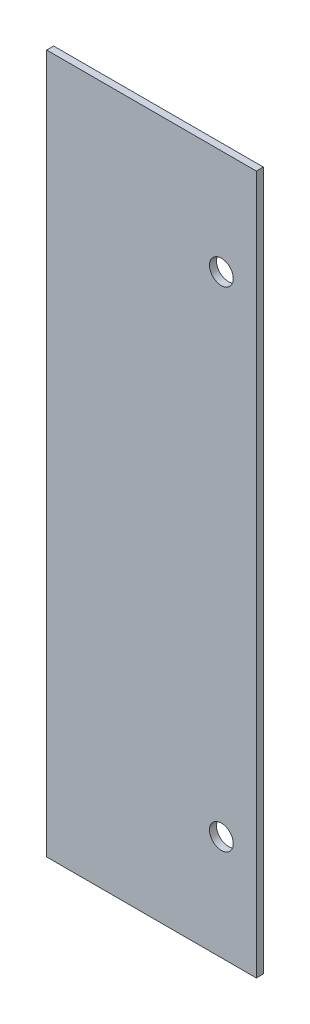
ISO-10303-21;
HEADER;
FILE_DESCRIPTION(('STEP AP214'),'2;1');
FILE_NAME('part.step','',(''),(''),'','','');
FILE_SCHEMA(('AUTOMOTIVE_DESIGN { 1 0 10303 214 1 1 1 1 }'));
ENDSEC;
DATA;
#1=APPLICATION_CONTEXT('core data for automotive mechanical design processes');
#2=APPLICATION_PROTOCOL_DEFINITION('international standard','automotive_design',2000,#1);
#3=PRODUCT_CONTEXT('',#1,'mechanical');
#4=PRODUCT('Part','Part','',(#3));
#5=PRODUCT_RELATED_PRODUCT_CATEGORY('part','',(#4));
#6=PRODUCT_DEFINITION_FORMATION('','',#4);
#7=PRODUCT_DEFINITION_CONTEXT('part definition',#1,'design');
#8=PRODUCT_DEFINITION('design','',#6,#7);
#9=PRODUCT_DEFINITION_SHAPE('','',#8);
#10=(LENGTH_UNIT() NAMED_UNIT(*) SI_UNIT(.MILLI.,.METRE.));
#11=(NAMED_UNIT(*) PLANE_ANGLE_UNIT() SI_UNIT($,.RADIAN.));
#12=(NAMED_UNIT(*) SI_UNIT($,.STERADIAN.) SOLID_ANGLE_UNIT());
#13=UNCERTAINTY_MEASURE_WITH_UNIT(LENGTH_MEASURE(1.E-05),#10,'distance_accuracy_value','');
#14=(GEOMETRIC_REPRESENTATION_CONTEXT(3) GLOBAL_UNCERTAINTY_ASSIGNED_CONTEXT((#13)) GLOBAL_UNIT_ASSIGNED_CONTEXT((#10,
#11,#12)) REPRESENTATION_CONTEXT('',''));
#15=CARTESIAN_POINT('',(0.,0.,0.));
#16=DIRECTION('',(0.,0.,1.));
#17=DIRECTION('',(1.,0.,0.));
#18=AXIS2_PLACEMENT_3D('',#15,#16,#17);
#19=CARTESIAN_POINT('',(0.,0.,0.));
#20=DIRECTION('',(0.,0.,-1.));
#21=DIRECTION('',(-1.,0.,0.));
#22=AXIS2_PLACEMENT_3D('',#19,#20,#21);
#23=PLANE('',#22);
#24=DIRECTION('',(0.,1.,0.));
#25=VECTOR('',#24,1.);
#26=CARTESIAN_POINT('',(15.,-50.,0.));
#27=LINE('',#26,#25);
#28=CARTESIAN_POINT('',(15.,-50.,0.));
#29=VERTEX_POINT('',#28);
#30=CARTESIAN_POINT('',(15.,50.,0.));
#31=VERTEX_POINT('',#30);
#32=EDGE_CURVE('E112',#29,#31,#27,.T.);
#33=ORIENTED_EDGE('',*,*,#32,.T.);
#34=DIRECTION('',(-1.,0.,0.));
#35=VECTOR('',#34,1.);
#36=CARTESIAN_POINT('',(-15.,50.,0.));
#37=LINE('',#36,#35);
#38=CARTESIAN_POINT('',(-15.,50.,0.));
#39=VERTEX_POINT('',#38);
#40=EDGE_CURVE('E111',#31,#39,#37,.T.);
#41=ORIENTED_EDGE('',*,*,#40,.T.);
#42=DIRECTION('',(0.,-1.,0.));
#43=VECTOR('',#42,1.);
#44=CARTESIAN_POINT('',(-15.,-50.,0.));
#45=LINE('',#44,#43);
#46=CARTESIAN_POINT('',(-15.,-50.,0.));
#47=VERTEX_POINT('',#46);
#48=EDGE_CURVE('E92',#39,#47,#45,.T.);
#49=ORIENTED_EDGE('',*,*,#48,.T.);
#50=DIRECTION('',(1.,0.,0.));
#51=VECTOR('',#50,1.);
#52=CARTESIAN_POINT('',(-15.,-50.,0.));
#53=LINE('',#52,#51);
#54=EDGE_CURVE('E106',#47,#29,#53,.T.);
#55=ORIENTED_EDGE('',*,*,#54,.T.);
#56=EDGE_LOOP('',(#33,#41,#49,#55));
#57=FACE_BOUND('',#56,.T.);
#58=CARTESIAN_POINT('',(10.,35.,1.2E-05));
#59=DIRECTION('',(0.,0.,1.));
#60=DIRECTION('',(1.,0.,0.));
#61=AXIS2_PLACEMENT_3D('',#58,#59,#60);
#62=CIRCLE('',#61,1.7);
#63=CARTESIAN_POINT('',(11.7,35.,1.2E-05));
#64=VERTEX_POINT('',#63);
#65=EDGE_CURVE('E127',#64,#64,#62,.T.);
#66=ORIENTED_EDGE('',*,*,#65,.F.);
#67=EDGE_LOOP('',(#66));
#68=FACE_BOUND('',#67,.T.);
#69=CARTESIAN_POINT('',(10.,-35.,1.2E-05));
#70=DIRECTION('',(0.,0.,1.));
#71=DIRECTION('',(1.,0.,0.));
#72=AXIS2_PLACEMENT_3D('',#69,#70,#71);
#73=CIRCLE('',#72,1.7);
#74=CARTESIAN_POINT('',(11.7,-35.,1.2E-05));
#75=VERTEX_POINT('',#74);
#76=EDGE_CURVE('E113',#75,#75,#73,.T.);
#77=ORIENTED_EDGE('',*,*,#76,.F.);
#78=EDGE_LOOP('',(#77));
#79=FACE_BOUND('',#78,.T.);
#80=ADVANCED_FACE('F41',(#57,#68,#79),#23,.F.);
#81=CARTESIAN_POINT('',(15.,-50.,-1.));
#82=DIRECTION('',(1.,0.,0.));
#83=DIRECTION('',(0.,0.,-1.));
#84=AXIS2_PLACEMENT_3D('',#81,#82,#83);
#85=PLANE('',#84);
#86=ORIENTED_EDGE('',*,*,#32,.F.);
#87=DIRECTION('',(0.,0.,1.));
#88=VECTOR('',#87,1.);
#89=CARTESIAN_POINT('',(15.,-50.,-1.));
#90=LINE('',#89,#88);
#91=CARTESIAN_POINT('',(15.,-50.,-1.));
#92=VERTEX_POINT('',#91);
#93=EDGE_CURVE('E11',#92,#29,#90,.T.);
#94=ORIENTED_EDGE('',*,*,#93,.F.);
#95=DIRECTION('',(0.,1.,0.));
#96=VECTOR('',#95,1.);
#97=CARTESIAN_POINT('',(15.,-50.,-1.));
#98=LINE('',#97,#96);
#99=CARTESIAN_POINT('',(15.,50.,-1.));
#100=VERTEX_POINT('',#99);
#101=EDGE_CURVE('E102',#92,#100,#98,.T.);
#102=ORIENTED_EDGE('',*,*,#101,.T.);
#103=DIRECTION('',(0.,0.,1.));
#104=VECTOR('',#103,1.);
#105=CARTESIAN_POINT('',(15.,50.,-1.));
#106=LINE('',#105,#104);
#107=EDGE_CURVE('E87',#100,#31,#106,.T.);
#108=ORIENTED_EDGE('',*,*,#107,.T.);
#109=EDGE_LOOP('',(#86,#94,#102,#108));
#110=FACE_BOUND('',#109,.T.);
#111=ADVANCED_FACE('F43',(#110),#85,.T.);
#112=CARTESIAN_POINT('',(-15.,-50.,-1.));
#113=DIRECTION('',(0.,-1.,0.));
#114=DIRECTION('',(0.,0.,-1.));
#115=AXIS2_PLACEMENT_3D('',#112,#113,#114);
#116=PLANE('',#115);
#117=ORIENTED_EDGE('',*,*,#54,.F.);
#118=DIRECTION('',(0.,0.,1.));
#119=VECTOR('',#118,1.);
#120=CARTESIAN_POINT('',(-15.,-50.,-1.));
#121=LINE('',#120,#119);
#122=CARTESIAN_POINT('',(-15.,-50.,-1.));
#123=VERTEX_POINT('',#122);
#124=EDGE_CURVE('E52',#123,#47,#121,.T.);
#125=ORIENTED_EDGE('',*,*,#124,.F.);
#126=DIRECTION('',(1.,0.,0.));
#127=VECTOR('',#126,1.);
#128=CARTESIAN_POINT('',(-15.,-50.,-1.));
#129=LINE('',#128,#127);
#130=EDGE_CURVE('E101',#123,#92,#129,.T.);
#131=ORIENTED_EDGE('',*,*,#130,.T.);
#132=ORIENTED_EDGE('',*,*,#93,.T.);
#133=EDGE_LOOP('',(#117,#125,#131,#132));
#134=FACE_BOUND('',#133,.T.);
#135=ADVANCED_FACE('F143',(#134),#116,.T.);
#136=CARTESIAN_POINT('',(-15.,-50.,-1.));
#137=DIRECTION('',(-1.,0.,0.));
#138=DIRECTION('',(0.,0.,1.));
#139=AXIS2_PLACEMENT_3D('',#136,#137,#138);
#140=PLANE('',#139);
#141=ORIENTED_EDGE('',*,*,#48,.F.);
#142=DIRECTION('',(0.,0.,1.));
#143=VECTOR('',#142,1.);
#144=CARTESIAN_POINT('',(-15.,50.,-1.));
#145=LINE('',#144,#143);
#146=CARTESIAN_POINT('',(-15.,50.,-1.));
#147=VERTEX_POINT('',#146);
#148=EDGE_CURVE('E89',#147,#39,#145,.T.);
#149=ORIENTED_EDGE('',*,*,#148,.F.);
#150=DIRECTION('',(0.,-1.,0.));
#151=VECTOR('',#150,1.);
#152=CARTESIAN_POINT('',(-15.,-50.,-1.));
#153=LINE('',#152,#151);
#154=EDGE_CURVE('E91',#147,#123,#153,.T.);
#155=ORIENTED_EDGE('',*,*,#154,.T.);
#156=ORIENTED_EDGE('',*,*,#124,.T.);
#157=EDGE_LOOP('',(#141,#149,#155,#156));
#158=FACE_BOUND('',#157,.T.);
#159=ADVANCED_FACE('F95',(#158),#140,.T.);
#160=CARTESIAN_POINT('',(-15.,50.,-1.));
#161=DIRECTION('',(0.,1.,0.));
#162=DIRECTION('',(0.,0.,1.));
#163=AXIS2_PLACEMENT_3D('',#160,#161,#162);
#164=PLANE('',#163);
#165=ORIENTED_EDGE('',*,*,#40,.F.);
#166=ORIENTED_EDGE('',*,*,#107,.F.);
#167=DIRECTION('',(-1.,0.,0.));
#168=VECTOR('',#167,1.);
#169=CARTESIAN_POINT('',(-15.,50.,-1.));
#170=LINE('',#169,#168);
#171=EDGE_CURVE('E99',#100,#147,#170,.T.);
#172=ORIENTED_EDGE('',*,*,#171,.T.);
#173=ORIENTED_EDGE('',*,*,#148,.T.);
#174=EDGE_LOOP('',(#165,#166,#172,#173));
#175=FACE_BOUND('',#174,.T.);
#176=ADVANCED_FACE('F103',(#175),#164,.T.);
#177=CARTESIAN_POINT('',(0.,0.,-1.));
#178=DIRECTION('',(0.,0.,-1.));
#179=DIRECTION('',(-1.,0.,0.));
#180=AXIS2_PLACEMENT_3D('',#177,#178,#179);
#181=PLANE('',#180);
#182=CARTESIAN_POINT('',(10.,-35.,-1.));
#183=DIRECTION('',(0.,0.,1.));
#184=DIRECTION('',(1.,0.,0.));
#185=AXIS2_PLACEMENT_3D('',#182,#183,#184);
#186=CIRCLE('',#185,1.7);
#187=CARTESIAN_POINT('',(11.7,-35.,-1.));
#188=VERTEX_POINT('',#187);
#189=EDGE_CURVE('E159',#188,#188,#186,.T.);
#190=ORIENTED_EDGE('',*,*,#189,.T.);
#191=EDGE_LOOP('',(#190));
#192=FACE_BOUND('',#191,.T.);
#193=CARTESIAN_POINT('',(10.,35.,-1.));
#194=DIRECTION('',(0.,0.,1.));
#195=DIRECTION('',(1.,0.,0.));
#196=AXIS2_PLACEMENT_3D('',#193,#194,#195);
#197=CIRCLE('',#196,1.7);
#198=CARTESIAN_POINT('',(11.7,35.,-1.));
#199=VERTEX_POINT('',#198);
#200=EDGE_CURVE('E162',#199,#199,#197,.T.);
#201=ORIENTED_EDGE('',*,*,#200,.T.);
#202=EDGE_LOOP('',(#201));
#203=FACE_BOUND('',#202,.T.);
#204=ORIENTED_EDGE('',*,*,#101,.F.);
#205=ORIENTED_EDGE('',*,*,#130,.F.);
#206=ORIENTED_EDGE('',*,*,#154,.F.);
#207=ORIENTED_EDGE('',*,*,#171,.F.);
#208=EDGE_LOOP('',(#204,#205,#206,#207));
#209=FACE_BOUND('',#208,.T.);
#210=ADVANCED_FACE('F97',(#192,#203,#209),#181,.T.);
#211=CARTESIAN_POINT('',(10.,35.,1.2E-05));
#212=DIRECTION('',(0.,0.,-1.));
#213=DIRECTION('',(-1.,0.,0.));
#214=AXIS2_PLACEMENT_3D('',#211,#212,#213);
#215=CYLINDRICAL_SURFACE('',#214,1.7);
#216=ORIENTED_EDGE('',*,*,#65,.T.);
#217=EDGE_LOOP('',(#216));
#218=FACE_BOUND('',#217,.T.);
#219=ORIENTED_EDGE('',*,*,#200,.F.);
#220=EDGE_LOOP('',(#219));
#221=FACE_BOUND('',#220,.T.);
#222=ADVANCED_FACE('F147',(#218,#221),#215,.F.);
#223=CARTESIAN_POINT('',(10.,-35.,1.2E-05));
#224=DIRECTION('',(0.,0.,-1.));
#225=DIRECTION('',(-1.,0.,0.));
#226=AXIS2_PLACEMENT_3D('',#223,#224,#225);
#227=CYLINDRICAL_SURFACE('',#226,1.7);
#228=ORIENTED_EDGE('',*,*,#76,.T.);
#229=EDGE_LOOP('',(#228));
#230=FACE_BOUND('',#229,.T.);
#231=ORIENTED_EDGE('',*,*,#189,.F.);
#232=EDGE_LOOP('',(#231));
#233=FACE_BOUND('',#232,.T.);
#234=ADVANCED_FACE('F154',(#230,#233),#227,.F.);
#235=CLOSED_SHELL('',(#80,#111,#135,#159,#176,#210,#222,#234));
#236=MANIFOLD_SOLID_BREP('B2',#235);
#237=ADVANCED_BREP_SHAPE_REPRESENTATION('',(#18,#236),#14);
#238=SHAPE_DEFINITION_REPRESENTATION(#9,#237);
ENDSEC;
END-ISO-10303-21;
